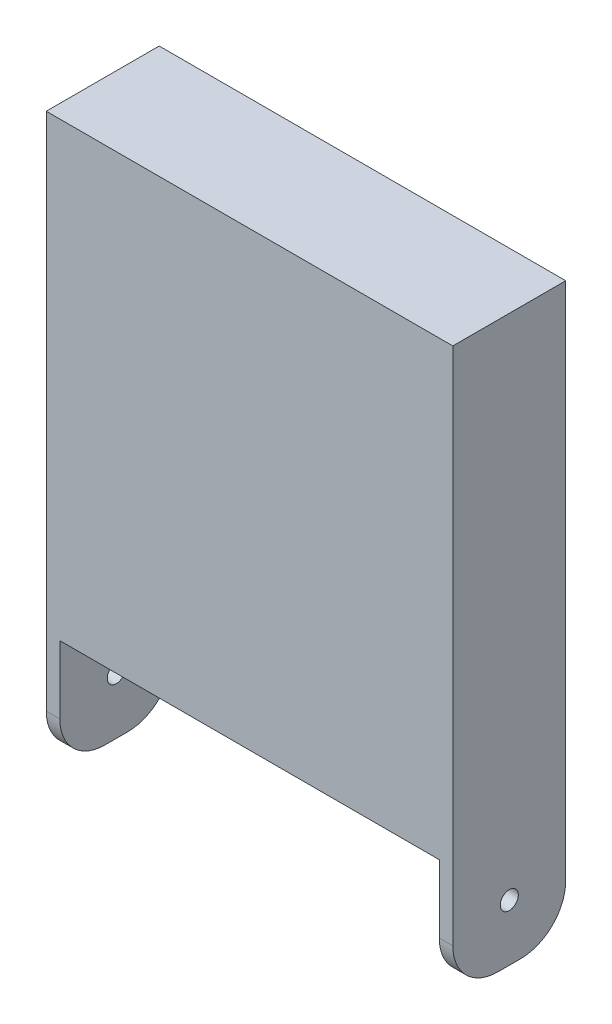
ISO-10303-21;
HEADER;
FILE_DESCRIPTION(('STEP AP214'),'2;1');
FILE_NAME('part.step','',(''),(''),'','','');
FILE_SCHEMA(('AUTOMOTIVE_DESIGN { 1 0 10303 214 1 1 1 1 }'));
ENDSEC;
DATA;
#1=APPLICATION_CONTEXT('core data for automotive mechanical design processes');
#2=APPLICATION_PROTOCOL_DEFINITION('international standard','automotive_design',2000,#1);
#3=PRODUCT_CONTEXT('',#1,'mechanical');
#4=PRODUCT('Part','Part','',(#3));
#5=PRODUCT_RELATED_PRODUCT_CATEGORY('part','',(#4));
#6=PRODUCT_DEFINITION_FORMATION('','',#4);
#7=PRODUCT_DEFINITION_CONTEXT('part definition',#1,'design');
#8=PRODUCT_DEFINITION('design','',#6,#7);
#9=PRODUCT_DEFINITION_SHAPE('','',#8);
#10=(LENGTH_UNIT() NAMED_UNIT(*) SI_UNIT(.MILLI.,.METRE.));
#11=(NAMED_UNIT(*) PLANE_ANGLE_UNIT() SI_UNIT($,.RADIAN.));
#12=(NAMED_UNIT(*) SI_UNIT($,.STERADIAN.) SOLID_ANGLE_UNIT());
#13=UNCERTAINTY_MEASURE_WITH_UNIT(LENGTH_MEASURE(1.E-05),#10,'distance_accuracy_value','');
#14=(GEOMETRIC_REPRESENTATION_CONTEXT(3) GLOBAL_UNCERTAINTY_ASSIGNED_CONTEXT((#13)) GLOBAL_UNIT_ASSIGNED_CONTEXT((#10,
#11,#12)) REPRESENTATION_CONTEXT('',''));
#15=CARTESIAN_POINT('',(0.,0.,0.));
#16=DIRECTION('',(0.,0.,1.));
#17=DIRECTION('',(1.,0.,0.));
#18=AXIS2_PLACEMENT_3D('',#15,#16,#17);
#19=CARTESIAN_POINT('',(0.,0.,0.));
#20=DIRECTION('',(0.,1.,0.));
#21=DIRECTION('',(0.,0.,1.));
#22=AXIS2_PLACEMENT_3D('',#19,#20,#21);
#23=PLANE('',#22);
#24=DIRECTION('',(0.,0.,-1.));
#25=VECTOR('',#24,1.);
#26=CARTESIAN_POINT('',(84.,0.,25.));
#27=LINE('',#26,#25);
#28=CARTESIAN_POINT('',(84.,0.,25.));
#29=VERTEX_POINT('',#28);
#30=CARTESIAN_POINT('',(84.,0.,-25.));
#31=VERTEX_POINT('',#30);
#32=EDGE_CURVE('E126',#29,#31,#27,.T.);
#33=ORIENTED_EDGE('',*,*,#32,.F.);
#34=DIRECTION('',(1.,0.,0.));
#35=VECTOR('',#34,1.);
#36=CARTESIAN_POINT('',(-90.,0.,25.));
#37=LINE('',#36,#35);
#38=CARTESIAN_POINT('',(-84.,0.,25.));
#39=VERTEX_POINT('',#38);
#40=EDGE_CURVE('E136',#39,#29,#37,.T.);
#41=ORIENTED_EDGE('',*,*,#40,.F.);
#42=DIRECTION('',(0.,0.,1.));
#43=VECTOR('',#42,1.);
#44=CARTESIAN_POINT('',(-84.,0.,25.));
#45=LINE('',#44,#43);
#46=CARTESIAN_POINT('',(-84.,0.,-25.));
#47=VERTEX_POINT('',#46);
#48=EDGE_CURVE('E130',#47,#39,#45,.T.);
#49=ORIENTED_EDGE('',*,*,#48,.F.);
#50=DIRECTION('',(-1.,0.,0.));
#51=VECTOR('',#50,1.);
#52=CARTESIAN_POINT('',(-90.,0.,-25.));
#53=LINE('',#52,#51);
#54=EDGE_CURVE('E139',#31,#47,#53,.T.);
#55=ORIENTED_EDGE('',*,*,#54,.F.);
#56=EDGE_LOOP('',(#33,#41,#49,#55));
#57=FACE_BOUND('',#56,.T.);
#58=ADVANCED_FACE('F35',(#57),#23,.F.);
#59=CARTESIAN_POINT('',(90.,200.,-25.));
#60=DIRECTION('',(-1.,0.,0.));
#61=DIRECTION('',(0.,0.,1.));
#62=AXIS2_PLACEMENT_3D('',#59,#60,#61);
#63=PLANE('',#62);
#64=CARTESIAN_POINT('',(90.,-25.,0.));
#65=DIRECTION('',(-1.,0.,0.));
#66=DIRECTION('',(0.,0.,1.));
#67=AXIS2_PLACEMENT_3D('',#64,#65,#66);
#68=CIRCLE('',#67,4.);
#69=CARTESIAN_POINT('',(90.,-25.,-4.));
#70=VERTEX_POINT('',#69);
#71=EDGE_CURVE('E141',#70,#70,#68,.F.);
#72=ORIENTED_EDGE('',*,*,#71,.F.);
#73=EDGE_LOOP('',(#72));
#74=FACE_BOUND('',#73,.T.);
#75=DIRECTION('',(0.,0.,1.));
#76=VECTOR('',#75,1.);
#77=CARTESIAN_POINT('',(90.,-50.,25.));
#78=LINE('',#77,#76);
#79=CARTESIAN_POINT('',(90.,-50.,-5.00000000000001));
#80=VERTEX_POINT('',#79);
#81=CARTESIAN_POINT('',(90.,-50.,5.));
#82=VERTEX_POINT('',#81);
#83=EDGE_CURVE('E140',#80,#82,#78,.T.);
#84=ORIENTED_EDGE('',*,*,#83,.F.);
#85=CARTESIAN_POINT('',(90.,-30.,-5.00000000000001));
#86=DIRECTION('',(-1.,0.,0.));
#87=DIRECTION('',(0.,0.,1.));
#88=AXIS2_PLACEMENT_3D('',#85,#86,#87);
#89=CIRCLE('',#88,20.);
#90=CARTESIAN_POINT('',(90.,-30.,-25.));
#91=VERTEX_POINT('',#90);
#92=EDGE_CURVE('E201',#80,#91,#89,.F.);
#93=ORIENTED_EDGE('',*,*,#92,.T.);
#94=DIRECTION('',(0.,-1.,0.));
#95=VECTOR('',#94,1.);
#96=CARTESIAN_POINT('',(90.,200.,-25.));
#97=LINE('',#96,#95);
#98=CARTESIAN_POINT('',(90.,200.,-25.));
#99=VERTEX_POINT('',#98);
#100=EDGE_CURVE('E165',#99,#91,#97,.T.);
#101=ORIENTED_EDGE('',*,*,#100,.F.);
#102=DIRECTION('',(0.,0.,-1.));
#103=VECTOR('',#102,1.);
#104=CARTESIAN_POINT('',(90.,200.,-25.));
#105=LINE('',#104,#103);
#106=CARTESIAN_POINT('',(90.,200.,25.));
#107=VERTEX_POINT('',#106);
#108=EDGE_CURVE('E147',#107,#99,#105,.T.);
#109=ORIENTED_EDGE('',*,*,#108,.F.);
#110=DIRECTION('',(0.,-1.,0.));
#111=VECTOR('',#110,1.);
#112=CARTESIAN_POINT('',(90.,200.,25.));
#113=LINE('',#112,#111);
#114=CARTESIAN_POINT('',(90.,-30.,25.));
#115=VERTEX_POINT('',#114);
#116=EDGE_CURVE('E156',#107,#115,#113,.T.);
#117=ORIENTED_EDGE('',*,*,#116,.T.);
#118=CARTESIAN_POINT('',(90.,-30.,5.));
#119=DIRECTION('',(-1.,0.,0.));
#120=DIRECTION('',(0.,0.,1.));
#121=AXIS2_PLACEMENT_3D('',#118,#119,#120);
#122=CIRCLE('',#121,20.);
#123=EDGE_CURVE('E199',#115,#82,#122,.F.);
#124=ORIENTED_EDGE('',*,*,#123,.T.);
#125=EDGE_LOOP('',(#84,#93,#101,#109,#117,#124));
#126=FACE_BOUND('',#125,.T.);
#127=ADVANCED_FACE('F205',(#74,#126),#63,.F.);
#128=CARTESIAN_POINT('',(-90.,200.,-25.));
#129=DIRECTION('',(0.,0.,1.));
#130=DIRECTION('',(1.,0.,0.));
#131=AXIS2_PLACEMENT_3D('',#128,#129,#130);
#132=PLANE('',#131);
#133=DIRECTION('',(0.,1.,0.));
#134=VECTOR('',#133,1.);
#135=CARTESIAN_POINT('',(-84.,-50.,-25.));
#136=LINE('',#135,#134);
#137=CARTESIAN_POINT('',(-84.,-30.,-25.));
#138=VERTEX_POINT('',#137);
#139=EDGE_CURVE('E152',#138,#47,#136,.T.);
#140=ORIENTED_EDGE('',*,*,#139,.F.);
#141=DIRECTION('',(1.,0.,0.));
#142=VECTOR('',#141,1.);
#143=CARTESIAN_POINT('',(-90.,-30.,-25.));
#144=LINE('',#143,#142);
#145=CARTESIAN_POINT('',(-90.,-30.,-25.));
#146=VERTEX_POINT('',#145);
#147=EDGE_CURVE('E184',#138,#146,#144,.F.);
#148=ORIENTED_EDGE('',*,*,#147,.T.);
#149=DIRECTION('',(0.,-1.,0.));
#150=VECTOR('',#149,1.);
#151=CARTESIAN_POINT('',(-90.,200.,-25.));
#152=LINE('',#151,#150);
#153=CARTESIAN_POINT('',(-90.,200.,-25.));
#154=VERTEX_POINT('',#153);
#155=EDGE_CURVE('E162',#154,#146,#152,.T.);
#156=ORIENTED_EDGE('',*,*,#155,.F.);
#157=DIRECTION('',(-1.,0.,0.));
#158=VECTOR('',#157,1.);
#159=CARTESIAN_POINT('',(-90.,200.,-25.));
#160=LINE('',#159,#158);
#161=EDGE_CURVE('E150',#99,#154,#160,.T.);
#162=ORIENTED_EDGE('',*,*,#161,.F.);
#163=ORIENTED_EDGE('',*,*,#100,.T.);
#164=DIRECTION('',(1.,0.,0.));
#165=VECTOR('',#164,1.);
#166=CARTESIAN_POINT('',(-90.,-30.,-25.));
#167=LINE('',#166,#165);
#168=CARTESIAN_POINT('',(84.,-30.,-25.));
#169=VERTEX_POINT('',#168);
#170=EDGE_CURVE('E182',#91,#169,#167,.F.);
#171=ORIENTED_EDGE('',*,*,#170,.T.);
#172=DIRECTION('',(0.,1.,0.));
#173=VECTOR('',#172,1.);
#174=CARTESIAN_POINT('',(84.,-50.,-25.));
#175=LINE('',#174,#173);
#176=EDGE_CURVE('E131',#169,#31,#175,.T.);
#177=ORIENTED_EDGE('',*,*,#176,.T.);
#178=ORIENTED_EDGE('',*,*,#54,.T.);
#179=EDGE_LOOP('',(#140,#148,#156,#162,#163,#171,#177,#178));
#180=FACE_BOUND('',#179,.T.);
#181=ADVANCED_FACE('F213',(#180),#132,.F.);
#182=CARTESIAN_POINT('',(-90.,200.,-25.));
#183=DIRECTION('',(1.,0.,0.));
#184=DIRECTION('',(0.,0.,-1.));
#185=AXIS2_PLACEMENT_3D('',#182,#183,#184);
#186=PLANE('',#185);
#187=CARTESIAN_POINT('',(-90.,-25.,0.));
#188=DIRECTION('',(1.,0.,0.));
#189=DIRECTION('',(0.,0.,-1.));
#190=AXIS2_PLACEMENT_3D('',#187,#188,#189);
#191=CIRCLE('',#190,4.);
#192=CARTESIAN_POINT('',(-90.,-25.,-4.));
#193=VERTEX_POINT('',#192);
#194=EDGE_CURVE('E310',#193,#193,#191,.F.);
#195=ORIENTED_EDGE('',*,*,#194,.F.);
#196=EDGE_LOOP('',(#195));
#197=FACE_BOUND('',#196,.T.);
#198=ORIENTED_EDGE('',*,*,#155,.T.);
#199=CARTESIAN_POINT('',(-90.,-30.,-5.00000000000001));
#200=DIRECTION('',(1.,0.,0.));
#201=DIRECTION('',(0.,0.,-1.));
#202=AXIS2_PLACEMENT_3D('',#199,#200,#201);
#203=CIRCLE('',#202,20.);
#204=CARTESIAN_POINT('',(-90.,-50.,-5.00000000000001));
#205=VERTEX_POINT('',#204);
#206=EDGE_CURVE('E188',#146,#205,#203,.F.);
#207=ORIENTED_EDGE('',*,*,#206,.T.);
#208=DIRECTION('',(0.,0.,-1.));
#209=VECTOR('',#208,1.);
#210=CARTESIAN_POINT('',(-90.,-50.,25.));
#211=LINE('',#210,#209);
#212=CARTESIAN_POINT('',(-90.,-50.,5.));
#213=VERTEX_POINT('',#212);
#214=EDGE_CURVE('E224',#213,#205,#211,.T.);
#215=ORIENTED_EDGE('',*,*,#214,.F.);
#216=CARTESIAN_POINT('',(-90.,-30.,5.));
#217=DIRECTION('',(1.,0.,0.));
#218=DIRECTION('',(0.,0.,-1.));
#219=AXIS2_PLACEMENT_3D('',#216,#217,#218);
#220=CIRCLE('',#219,20.);
#221=CARTESIAN_POINT('',(-90.,-30.,25.));
#222=VERTEX_POINT('',#221);
#223=EDGE_CURVE('E186',#213,#222,#220,.F.);
#224=ORIENTED_EDGE('',*,*,#223,.T.);
#225=DIRECTION('',(0.,-1.,0.));
#226=VECTOR('',#225,1.);
#227=CARTESIAN_POINT('',(-90.,200.,25.));
#228=LINE('',#227,#226);
#229=CARTESIAN_POINT('',(-90.,200.,25.));
#230=VERTEX_POINT('',#229);
#231=EDGE_CURVE('E159',#230,#222,#228,.T.);
#232=ORIENTED_EDGE('',*,*,#231,.F.);
#233=DIRECTION('',(0.,0.,1.));
#234=VECTOR('',#233,1.);
#235=CARTESIAN_POINT('',(-90.,200.,-25.));
#236=LINE('',#235,#234);
#237=EDGE_CURVE('E234',#154,#230,#236,.T.);
#238=ORIENTED_EDGE('',*,*,#237,.F.);
#239=EDGE_LOOP('',(#198,#207,#215,#224,#232,#238));
#240=FACE_BOUND('',#239,.T.);
#241=ADVANCED_FACE('F259',(#197,#240),#186,.F.);
#242=CARTESIAN_POINT('',(-90.,200.,25.));
#243=DIRECTION('',(0.,0.,-1.));
#244=DIRECTION('',(-1.,0.,0.));
#245=AXIS2_PLACEMENT_3D('',#242,#243,#244);
#246=PLANE('',#245);
#247=ORIENTED_EDGE('',*,*,#231,.T.);
#248=DIRECTION('',(-1.,0.,0.));
#249=VECTOR('',#248,1.);
#250=CARTESIAN_POINT('',(-84.,-30.,25.));
#251=LINE('',#250,#249);
#252=CARTESIAN_POINT('',(-84.,-30.,25.));
#253=VERTEX_POINT('',#252);
#254=EDGE_CURVE('E192',#222,#253,#251,.F.);
#255=ORIENTED_EDGE('',*,*,#254,.T.);
#256=DIRECTION('',(0.,1.,0.));
#257=VECTOR('',#256,1.);
#258=CARTESIAN_POINT('',(-84.,-50.,25.));
#259=LINE('',#258,#257);
#260=EDGE_CURVE('E146',#253,#39,#259,.T.);
#261=ORIENTED_EDGE('',*,*,#260,.T.);
#262=ORIENTED_EDGE('',*,*,#40,.T.);
#263=DIRECTION('',(0.,1.,0.));
#264=VECTOR('',#263,1.);
#265=CARTESIAN_POINT('',(84.,-50.,25.));
#266=LINE('',#265,#264);
#267=CARTESIAN_POINT('',(84.,-30.,25.));
#268=VERTEX_POINT('',#267);
#269=EDGE_CURVE('E123',#268,#29,#266,.T.);
#270=ORIENTED_EDGE('',*,*,#269,.F.);
#271=DIRECTION('',(-1.,0.,0.));
#272=VECTOR('',#271,1.);
#273=CARTESIAN_POINT('',(-90.,-30.,25.));
#274=LINE('',#273,#272);
#275=EDGE_CURVE('E190',#268,#115,#274,.F.);
#276=ORIENTED_EDGE('',*,*,#275,.T.);
#277=ORIENTED_EDGE('',*,*,#116,.F.);
#278=DIRECTION('',(1.,0.,0.));
#279=VECTOR('',#278,1.);
#280=CARTESIAN_POINT('',(-90.,200.,25.));
#281=LINE('',#280,#279);
#282=EDGE_CURVE('E160',#230,#107,#281,.T.);
#283=ORIENTED_EDGE('',*,*,#282,.F.);
#284=EDGE_LOOP('',(#247,#255,#261,#262,#270,#276,#277,#283));
#285=FACE_BOUND('',#284,.T.);
#286=ADVANCED_FACE('F144',(#285),#246,.F.);
#287=CARTESIAN_POINT('',(0.,200.,0.));
#288=DIRECTION('',(0.,1.,0.));
#289=DIRECTION('',(0.,0.,1.));
#290=AXIS2_PLACEMENT_3D('',#287,#288,#289);
#291=PLANE('',#290);
#292=ORIENTED_EDGE('',*,*,#108,.T.);
#293=ORIENTED_EDGE('',*,*,#161,.T.);
#294=ORIENTED_EDGE('',*,*,#237,.T.);
#295=ORIENTED_EDGE('',*,*,#282,.T.);
#296=EDGE_LOOP('',(#292,#293,#294,#295));
#297=FACE_BOUND('',#296,.T.);
#298=ADVANCED_FACE('F238',(#297),#291,.T.);
#299=CARTESIAN_POINT('',(-84.,-50.,25.));
#300=DIRECTION('',(-1.,0.,0.));
#301=DIRECTION('',(0.,0.,1.));
#302=AXIS2_PLACEMENT_3D('',#299,#300,#301);
#303=PLANE('',#302);
#304=CARTESIAN_POINT('',(-84.,-25.,0.));
#305=DIRECTION('',(-1.,0.,0.));
#306=DIRECTION('',(0.,0.,1.));
#307=AXIS2_PLACEMENT_3D('',#304,#305,#306);
#308=CIRCLE('',#307,4.);
#309=CARTESIAN_POINT('',(-83.9999999999999,-25.,-4.));
#310=VERTEX_POINT('',#309);
#311=EDGE_CURVE('E172',#310,#310,#308,.F.);
#312=ORIENTED_EDGE('',*,*,#311,.F.);
#313=EDGE_LOOP('',(#312));
#314=FACE_BOUND('',#313,.T.);
#315=DIRECTION('',(0.,0.,1.));
#316=VECTOR('',#315,1.);
#317=CARTESIAN_POINT('',(-84.,-50.,25.));
#318=LINE('',#317,#316);
#319=CARTESIAN_POINT('',(-84.,-50.,-5.00000000000001));
#320=VERTEX_POINT('',#319);
#321=CARTESIAN_POINT('',(-84.,-50.,5.));
#322=VERTEX_POINT('',#321);
#323=EDGE_CURVE('E227',#320,#322,#318,.T.);
#324=ORIENTED_EDGE('',*,*,#323,.F.);
#325=CARTESIAN_POINT('',(-84.,-30.,-5.00000000000001));
#326=DIRECTION('',(-1.,0.,0.));
#327=DIRECTION('',(0.,0.,1.));
#328=AXIS2_PLACEMENT_3D('',#325,#326,#327);
#329=CIRCLE('',#328,20.);
#330=EDGE_CURVE('E180',#320,#138,#329,.F.);
#331=ORIENTED_EDGE('',*,*,#330,.T.);
#332=ORIENTED_EDGE('',*,*,#139,.T.);
#333=ORIENTED_EDGE('',*,*,#48,.T.);
#334=ORIENTED_EDGE('',*,*,#260,.F.);
#335=CARTESIAN_POINT('',(-84.,-30.,5.));
#336=DIRECTION('',(-1.,0.,0.));
#337=DIRECTION('',(0.,0.,1.));
#338=AXIS2_PLACEMENT_3D('',#335,#336,#337);
#339=CIRCLE('',#338,20.);
#340=EDGE_CURVE('E178',#253,#322,#339,.F.);
#341=ORIENTED_EDGE('',*,*,#340,.T.);
#342=EDGE_LOOP('',(#324,#331,#332,#333,#334,#341));
#343=FACE_BOUND('',#342,.T.);
#344=ADVANCED_FACE('F279',(#314,#343),#303,.F.);
#345=CARTESIAN_POINT('',(0.,-50.,0.));
#346=DIRECTION('',(0.,-1.,0.));
#347=DIRECTION('',(0.,0.,-1.));
#348=AXIS2_PLACEMENT_3D('',#345,#346,#347);
#349=PLANE('',#348);
#350=ORIENTED_EDGE('',*,*,#214,.T.);
#351=DIRECTION('',(1.,0.,0.));
#352=VECTOR('',#351,1.);
#353=CARTESIAN_POINT('',(-84.,-50.,-5.00000000000001));
#354=LINE('',#353,#352);
#355=EDGE_CURVE('E175',#205,#320,#354,.T.);
#356=ORIENTED_EDGE('',*,*,#355,.T.);
#357=ORIENTED_EDGE('',*,*,#323,.T.);
#358=DIRECTION('',(-1.,0.,0.));
#359=VECTOR('',#358,1.);
#360=CARTESIAN_POINT('',(-90.,-50.,5.));
#361=LINE('',#360,#359);
#362=EDGE_CURVE('E168',#322,#213,#361,.T.);
#363=ORIENTED_EDGE('',*,*,#362,.T.);
#364=EDGE_LOOP('',(#350,#356,#357,#363));
#365=FACE_BOUND('',#364,.T.);
#366=ADVANCED_FACE('F281',(#365),#349,.T.);
#367=CARTESIAN_POINT('',(84.,-50.,25.));
#368=DIRECTION('',(1.,0.,0.));
#369=DIRECTION('',(0.,0.,-1.));
#370=AXIS2_PLACEMENT_3D('',#367,#368,#369);
#371=PLANE('',#370);
#372=CARTESIAN_POINT('',(84.,-25.,0.));
#373=DIRECTION('',(1.,0.,0.));
#374=DIRECTION('',(0.,0.,-1.));
#375=AXIS2_PLACEMENT_3D('',#372,#373,#374);
#376=CIRCLE('',#375,4.);
#377=CARTESIAN_POINT('',(84.,-25.,-4.));
#378=VERTEX_POINT('',#377);
#379=EDGE_CURVE('E169',#378,#378,#376,.F.);
#380=ORIENTED_EDGE('',*,*,#379,.F.);
#381=EDGE_LOOP('',(#380));
#382=FACE_BOUND('',#381,.T.);
#383=ORIENTED_EDGE('',*,*,#176,.F.);
#384=CARTESIAN_POINT('',(84.,-30.,-5.00000000000001));
#385=DIRECTION('',(1.,0.,0.));
#386=DIRECTION('',(0.,0.,-1.));
#387=AXIS2_PLACEMENT_3D('',#384,#385,#386);
#388=CIRCLE('',#387,20.);
#389=CARTESIAN_POINT('',(84.,-50.,-5.00000000000001));
#390=VERTEX_POINT('',#389);
#391=EDGE_CURVE('E11',#169,#390,#388,.F.);
#392=ORIENTED_EDGE('',*,*,#391,.T.);
#393=DIRECTION('',(0.,0.,-1.));
#394=VECTOR('',#393,1.);
#395=CARTESIAN_POINT('',(84.,-50.,25.));
#396=LINE('',#395,#394);
#397=CARTESIAN_POINT('',(84.,-50.,5.));
#398=VERTEX_POINT('',#397);
#399=EDGE_CURVE('E218',#398,#390,#396,.T.);
#400=ORIENTED_EDGE('',*,*,#399,.F.);
#401=CARTESIAN_POINT('',(84.,-30.,5.));
#402=DIRECTION('',(1.,0.,0.));
#403=DIRECTION('',(0.,0.,-1.));
#404=AXIS2_PLACEMENT_3D('',#401,#402,#403);
#405=CIRCLE('',#404,20.);
#406=EDGE_CURVE('E43',#398,#268,#405,.F.);
#407=ORIENTED_EDGE('',*,*,#406,.T.);
#408=ORIENTED_EDGE('',*,*,#269,.T.);
#409=ORIENTED_EDGE('',*,*,#32,.T.);
#410=EDGE_LOOP('',(#383,#392,#400,#407,#408,#409));
#411=FACE_BOUND('',#410,.T.);
#412=ADVANCED_FACE('F125',(#382,#411),#371,.F.);
#413=CARTESIAN_POINT('',(0.,-50.,0.));
#414=DIRECTION('',(0.,1.,0.));
#415=DIRECTION('',(0.,0.,1.));
#416=AXIS2_PLACEMENT_3D('',#413,#414,#415);
#417=PLANE('',#416);
#418=ORIENTED_EDGE('',*,*,#399,.T.);
#419=DIRECTION('',(1.,0.,0.));
#420=VECTOR('',#419,1.);
#421=CARTESIAN_POINT('',(0.,-50.,-5.00000000000001));
#422=LINE('',#421,#420);
#423=EDGE_CURVE('E196',#390,#80,#422,.T.);
#424=ORIENTED_EDGE('',*,*,#423,.T.);
#425=ORIENTED_EDGE('',*,*,#83,.T.);
#426=DIRECTION('',(-1.,0.,0.));
#427=VECTOR('',#426,1.);
#428=CARTESIAN_POINT('',(0.,-50.,5.));
#429=LINE('',#428,#427);
#430=EDGE_CURVE('E194',#82,#398,#429,.T.);
#431=ORIENTED_EDGE('',*,*,#430,.T.);
#432=EDGE_LOOP('',(#418,#424,#425,#431));
#433=FACE_BOUND('',#432,.T.);
#434=ADVANCED_FACE('F217',(#433),#417,.F.);
#435=CARTESIAN_POINT('',(-393.,-25.,0.));
#436=DIRECTION('',(1.,0.,0.));
#437=DIRECTION('',(0.,0.,-1.));
#438=AXIS2_PLACEMENT_3D('',#435,#436,#437);
#439=CYLINDRICAL_SURFACE('',#438,4.);
#440=CARTESIAN_POINT('',(84.,-25.,-4.));
#441=CARTESIAN_POINT('',(84.0625,-25.,-4.));
#442=CARTESIAN_POINT('',(84.125,-25.,-4.));
#443=CARTESIAN_POINT('',(84.25,-25.,-4.));
#444=CARTESIAN_POINT('',(84.3125,-25.,-4.));
#445=CARTESIAN_POINT('',(84.4375,-25.,-4.));
#446=CARTESIAN_POINT('',(84.5,-25.,-4.));
#447=CARTESIAN_POINT('',(84.625,-25.,-4.));
#448=CARTESIAN_POINT('',(84.6875,-25.,-4.));
#449=CARTESIAN_POINT('',(84.8125,-25.,-4.));
#450=CARTESIAN_POINT('',(84.875,-25.,-4.));
#451=CARTESIAN_POINT('',(85.,-25.,-4.));
#452=CARTESIAN_POINT('',(85.0625,-25.,-4.));
#453=CARTESIAN_POINT('',(85.1875,-25.,-4.));
#454=CARTESIAN_POINT('',(85.25,-25.,-4.));
#455=CARTESIAN_POINT('',(85.375,-25.,-4.));
#456=CARTESIAN_POINT('',(85.4375,-25.,-4.));
#457=CARTESIAN_POINT('',(85.5625,-25.,-4.));
#458=CARTESIAN_POINT('',(85.625,-25.,-4.));
#459=CARTESIAN_POINT('',(85.75,-25.,-4.));
#460=CARTESIAN_POINT('',(85.8125,-25.,-4.));
#461=CARTESIAN_POINT('',(85.9375,-25.,-4.));
#462=CARTESIAN_POINT('',(86.,-25.,-4.));
#463=CARTESIAN_POINT('',(86.125,-25.,-4.));
#464=CARTESIAN_POINT('',(86.1875,-25.,-4.));
#465=CARTESIAN_POINT('',(86.3125,-25.,-4.));
#466=CARTESIAN_POINT('',(86.375,-25.,-4.));
#467=CARTESIAN_POINT('',(86.5,-25.,-4.));
#468=CARTESIAN_POINT('',(86.5625,-25.,-4.));
#469=CARTESIAN_POINT('',(86.6875,-25.,-4.));
#470=CARTESIAN_POINT('',(86.75,-25.,-4.));
#471=CARTESIAN_POINT('',(86.875,-25.,-4.));
#472=CARTESIAN_POINT('',(86.9375,-25.,-4.));
#473=CARTESIAN_POINT('',(87.0625,-25.,-4.));
#474=CARTESIAN_POINT('',(87.125,-25.,-4.));
#475=CARTESIAN_POINT('',(87.25,-25.,-4.));
#476=CARTESIAN_POINT('',(87.3125,-25.,-4.));
#477=CARTESIAN_POINT('',(87.4375,-25.,-4.));
#478=CARTESIAN_POINT('',(87.5,-25.,-4.));
#479=CARTESIAN_POINT('',(87.6250000000001,-25.,-4.));
#480=CARTESIAN_POINT('',(87.6875,-25.,-4.));
#481=CARTESIAN_POINT('',(87.8125,-25.,-4.));
#482=CARTESIAN_POINT('',(87.875,-25.,-4.));
#483=CARTESIAN_POINT('',(88.,-25.,-4.));
#484=CARTESIAN_POINT('',(88.0625,-25.,-4.));
#485=CARTESIAN_POINT('',(88.1875,-25.,-4.));
#486=CARTESIAN_POINT('',(88.25,-25.,-4.));
#487=CARTESIAN_POINT('',(88.375,-25.,-4.));
#488=CARTESIAN_POINT('',(88.4375,-25.,-4.));
#489=CARTESIAN_POINT('',(88.5625,-25.,-4.));
#490=CARTESIAN_POINT('',(88.625,-25.,-4.));
#491=CARTESIAN_POINT('',(88.75,-25.,-4.));
#492=CARTESIAN_POINT('',(88.8125,-25.,-4.));
#493=CARTESIAN_POINT('',(88.9375,-25.,-4.));
#494=CARTESIAN_POINT('',(89.,-25.,-4.));
#495=CARTESIAN_POINT('',(89.125,-25.,-4.));
#496=CARTESIAN_POINT('',(89.1875,-25.,-4.));
#497=CARTESIAN_POINT('',(89.3125,-25.,-4.));
#498=CARTESIAN_POINT('',(89.375,-25.,-4.));
#499=CARTESIAN_POINT('',(89.5,-25.,-4.));
#500=CARTESIAN_POINT('',(89.5625,-25.,-4.));
#501=CARTESIAN_POINT('',(89.6875,-25.,-4.));
#502=CARTESIAN_POINT('',(89.75,-25.,-4.));
#503=CARTESIAN_POINT('',(89.875,-25.,-4.));
#504=CARTESIAN_POINT('',(89.9375,-25.,-4.));
#505=CARTESIAN_POINT('',(90.,-25.,-4.));
#506=B_SPLINE_CURVE_WITH_KNOTS('',3,(#440,#441,#442,#443,#444,#445,#446,#447,#448,#449,#450,
#451,#452,#453,#454,#455,#456,#457,#458,#459,#460,#461,#462,#463,#464,#465,#466,#467,#468,#469,
#470,#471,#472,#473,#474,#475,#476,#477,#478,#479,#480,#481,#482,#483,#484,#485,#486,#487,#488,
#489,#490,#491,#492,#493,#494,#495,#496,#497,#498,#499,#500,#501,#502,#503,#504,#505),
.UNSPECIFIED.,.F.,.F.,(4,2,2,2,2,2,2,2,2,2,2,2,2,2,2,2,2,2,2,2,2,2,2,2,2,2,2,2,2,2,2,2,4),(0.,
0.187500000000007,0.375000000000014,0.562500000000021,0.750000000000028,0.93749999999998,
1.12499999999999,1.31249999999999,1.5,1.68750000000001,1.87500000000002,2.06250000000002,
2.24999999999997,2.43749999999998,2.62499999999999,2.8125,3.,3.18750000000001,3.37500000000002,
3.56250000000002,3.75000000000003,3.93749999999998,4.12499999999999,4.3125,4.5,4.68750000000001,
4.87500000000002,5.06250000000002,5.24999999999998,5.43749999999998,5.62499999999999,5.8125,
6.00000000000001),.UNSPECIFIED.);
#507=EDGE_CURVE('BSEAM299',#378,#70,#506,.T.);
#508=ORIENTED_EDGE('',*,*,#379,.T.);
#509=ORIENTED_EDGE('',*,*,#71,.T.);
#510=ORIENTED_EDGE('',*,*,#507,.T.);
#511=ORIENTED_EDGE('',*,*,#507,.F.);
#512=EDGE_LOOP('',(#508,#510,#509,#511));
#513=FACE_BOUND('',#512,.T.);
#514=ADVANCED_FACE('F299',(#513),#439,.F.);
#515=CARTESIAN_POINT('',(-83.9999999999999,-25.,-4.));
#516=CARTESIAN_POINT('',(-84.0624999999999,-25.,-4.));
#517=CARTESIAN_POINT('',(-84.1249999999999,-25.,-4.));
#518=CARTESIAN_POINT('',(-84.2499999999999,-25.,-4.));
#519=CARTESIAN_POINT('',(-84.3124999999999,-25.,-4.));
#520=CARTESIAN_POINT('',(-84.4374999999999,-25.,-4.));
#521=CARTESIAN_POINT('',(-84.4999999999999,-25.,-4.));
#522=CARTESIAN_POINT('',(-84.6249999999999,-25.,-4.));
#523=CARTESIAN_POINT('',(-84.6874999999999,-25.,-4.));
#524=CARTESIAN_POINT('',(-84.8124999999999,-25.,-4.));
#525=CARTESIAN_POINT('',(-84.8749999999999,-25.,-4.));
#526=CARTESIAN_POINT('',(-85.,-25.,-4.));
#527=CARTESIAN_POINT('',(-85.0624999999999,-25.,-4.));
#528=CARTESIAN_POINT('',(-85.1875,-25.,-4.));
#529=CARTESIAN_POINT('',(-85.25,-25.,-4.));
#530=CARTESIAN_POINT('',(-85.375,-25.,-4.));
#531=CARTESIAN_POINT('',(-85.4375,-25.,-4.));
#532=CARTESIAN_POINT('',(-85.5624999999999,-25.,-4.));
#533=CARTESIAN_POINT('',(-85.6249999999999,-25.,-4.));
#534=CARTESIAN_POINT('',(-85.7499999999999,-25.,-4.));
#535=CARTESIAN_POINT('',(-85.8124999999999,-25.,-4.));
#536=CARTESIAN_POINT('',(-85.9374999999999,-25.,-4.));
#537=CARTESIAN_POINT('',(-85.9999999999999,-25.,-4.));
#538=CARTESIAN_POINT('',(-86.1249999999999,-25.,-4.));
#539=CARTESIAN_POINT('',(-86.1874999999999,-25.,-4.));
#540=CARTESIAN_POINT('',(-86.3124999999999,-25.,-4.));
#541=CARTESIAN_POINT('',(-86.3749999999999,-25.,-4.));
#542=CARTESIAN_POINT('',(-86.5,-25.,-4.));
#543=CARTESIAN_POINT('',(-86.5624999999999,-25.,-4.));
#544=CARTESIAN_POINT('',(-86.6875,-25.,-4.));
#545=CARTESIAN_POINT('',(-86.75,-25.,-4.));
#546=CARTESIAN_POINT('',(-86.875,-25.,-4.));
#547=CARTESIAN_POINT('',(-86.9375,-25.,-4.));
#548=CARTESIAN_POINT('',(-87.0625,-25.,-4.));
#549=CARTESIAN_POINT('',(-87.125,-25.,-4.));
#550=CARTESIAN_POINT('',(-87.25,-25.,-4.));
#551=CARTESIAN_POINT('',(-87.3125,-25.,-4.));
#552=CARTESIAN_POINT('',(-87.4375,-25.,-4.));
#553=CARTESIAN_POINT('',(-87.5,-25.,-4.));
#554=CARTESIAN_POINT('',(-87.625,-25.,-4.));
#555=CARTESIAN_POINT('',(-87.6875,-25.,-4.));
#556=CARTESIAN_POINT('',(-87.8125,-25.,-4.));
#557=CARTESIAN_POINT('',(-87.875,-25.,-4.));
#558=CARTESIAN_POINT('',(-88.,-25.,-4.));
#559=CARTESIAN_POINT('',(-88.0625,-25.,-4.));
#560=CARTESIAN_POINT('',(-88.1875,-25.,-4.));
#561=CARTESIAN_POINT('',(-88.25,-25.,-4.));
#562=CARTESIAN_POINT('',(-88.375,-25.,-4.));
#563=CARTESIAN_POINT('',(-88.4375,-25.,-4.));
#564=CARTESIAN_POINT('',(-88.5625,-25.,-4.));
#565=CARTESIAN_POINT('',(-88.625,-25.,-4.));
#566=CARTESIAN_POINT('',(-88.75,-25.,-4.));
#567=CARTESIAN_POINT('',(-88.8125,-25.,-4.));
#568=CARTESIAN_POINT('',(-88.9375,-25.,-4.));
#569=CARTESIAN_POINT('',(-89.,-25.,-4.));
#570=CARTESIAN_POINT('',(-89.125,-25.,-4.));
#571=CARTESIAN_POINT('',(-89.1875,-25.,-4.));
#572=CARTESIAN_POINT('',(-89.3125,-25.,-4.));
#573=CARTESIAN_POINT('',(-89.375,-25.,-4.));
#574=CARTESIAN_POINT('',(-89.5,-25.,-4.));
#575=CARTESIAN_POINT('',(-89.5625,-25.,-4.));
#576=CARTESIAN_POINT('',(-89.6875,-25.,-4.));
#577=CARTESIAN_POINT('',(-89.75,-25.,-4.));
#578=CARTESIAN_POINT('',(-89.875,-25.,-4.));
#579=CARTESIAN_POINT('',(-89.9375,-25.,-4.));
#580=CARTESIAN_POINT('',(-90.,-25.,-4.));
#581=B_SPLINE_CURVE_WITH_KNOTS('',3,(#515,#516,#517,#518,#519,#520,#521,#522,#523,#524,#525,
#526,#527,#528,#529,#530,#531,#532,#533,#534,#535,#536,#537,#538,#539,#540,#541,#542,#543,#544,
#545,#546,#547,#548,#549,#550,#551,#552,#553,#554,#555,#556,#557,#558,#559,#560,#561,#562,#563,
#564,#565,#566,#567,#568,#569,#570,#571,#572,#573,#574,#575,#576,#577,#578,#579,#580),
.UNSPECIFIED.,.F.,.F.,(4,2,2,2,2,2,2,2,2,2,2,2,2,2,2,2,2,2,2,2,2,2,2,2,2,2,2,2,2,2,2,2,4),(0.,
0.187500000000007,0.375000000000014,0.562500000000021,0.750000000000028,0.937500000000036,
1.12500000000004,1.31250000000005,1.50000000000006,1.68750000000001,1.87500000000002,
2.06250000000002,2.25000000000003,2.43750000000004,2.62500000000004,2.81250000000005,
3.00000000000006,3.18750000000007,3.37500000000007,3.56250000000008,3.75000000000009,
3.93750000000009,4.1250000000001,4.31250000000011,4.50000000000006,4.68750000000007,
4.87500000000007,5.06250000000008,5.25000000000009,5.4375000000001,5.6250000000001,
5.81250000000011,6.00000000000012),.UNSPECIFIED.);
#582=EDGE_CURVE('BSEAM268',#310,#193,#581,.T.);
#583=ORIENTED_EDGE('',*,*,#311,.T.);
#584=ORIENTED_EDGE('',*,*,#194,.T.);
#585=ORIENTED_EDGE('',*,*,#582,.T.);
#586=ORIENTED_EDGE('',*,*,#582,.F.);
#587=EDGE_LOOP('',(#583,#585,#584,#586));
#588=FACE_BOUND('',#587,.T.);
#589=ADVANCED_FACE('F268',(#588),#439,.F.);
#590=CARTESIAN_POINT('',(0.,-30.,-5.00000000000001));
#591=DIRECTION('',(-1.,0.,0.));
#592=DIRECTION('',(0.,0.,1.));
#593=AXIS2_PLACEMENT_3D('',#590,#591,#592);
#594=CYLINDRICAL_SURFACE('',#593,20.);
#595=ORIENTED_EDGE('',*,*,#206,.F.);
#596=ORIENTED_EDGE('',*,*,#147,.F.);
#597=ORIENTED_EDGE('',*,*,#330,.F.);
#598=ORIENTED_EDGE('',*,*,#355,.F.);
#599=EDGE_LOOP('',(#595,#596,#597,#598));
#600=FACE_BOUND('',#599,.T.);
#601=ADVANCED_FACE('F265',(#600),#594,.T.);
#602=CARTESIAN_POINT('',(0.,-30.,5.));
#603=DIRECTION('',(1.,0.,0.));
#604=DIRECTION('',(0.,0.,-1.));
#605=AXIS2_PLACEMENT_3D('',#602,#603,#604);
#606=CYLINDRICAL_SURFACE('',#605,20.);
#607=ORIENTED_EDGE('',*,*,#340,.F.);
#608=ORIENTED_EDGE('',*,*,#254,.F.);
#609=ORIENTED_EDGE('',*,*,#223,.F.);
#610=ORIENTED_EDGE('',*,*,#362,.F.);
#611=EDGE_LOOP('',(#607,#608,#609,#610));
#612=FACE_BOUND('',#611,.T.);
#613=ADVANCED_FACE('F246',(#612),#606,.T.);
#614=CARTESIAN_POINT('',(0.,-30.,-5.00000000000001));
#615=DIRECTION('',(1.,0.,0.));
#616=DIRECTION('',(0.,0.,-1.));
#617=AXIS2_PLACEMENT_3D('',#614,#615,#616);
#618=CYLINDRICAL_SURFACE('',#617,20.);
#619=ORIENTED_EDGE('',*,*,#391,.F.);
#620=ORIENTED_EDGE('',*,*,#170,.F.);
#621=ORIENTED_EDGE('',*,*,#92,.F.);
#622=ORIENTED_EDGE('',*,*,#423,.F.);
#623=EDGE_LOOP('',(#619,#620,#621,#622));
#624=FACE_BOUND('',#623,.T.);
#625=ADVANCED_FACE('F215',(#624),#618,.T.);
#626=CARTESIAN_POINT('',(0.,-30.,5.));
#627=DIRECTION('',(-1.,0.,0.));
#628=DIRECTION('',(0.,0.,1.));
#629=AXIS2_PLACEMENT_3D('',#626,#627,#628);
#630=CYLINDRICAL_SURFACE('',#629,20.);
#631=ORIENTED_EDGE('',*,*,#123,.F.);
#632=ORIENTED_EDGE('',*,*,#275,.F.);
#633=ORIENTED_EDGE('',*,*,#406,.F.);
#634=ORIENTED_EDGE('',*,*,#430,.F.);
#635=EDGE_LOOP('',(#631,#632,#633,#634));
#636=FACE_BOUND('',#635,.T.);
#637=ADVANCED_FACE('F37',(#636),#630,.T.);
#638=CLOSED_SHELL('',(#58,#127,#181,#241,#286,#298,#344,#366,#412,#434,#514,#589,#601,#613,#625,#637));
#639=MANIFOLD_SOLID_BREP('B2',#638);
#640=ADVANCED_BREP_SHAPE_REPRESENTATION('',(#18,#639),#14);
#641=SHAPE_DEFINITION_REPRESENTATION(#9,#640);
ENDSEC;
END-ISO-10303-21;
